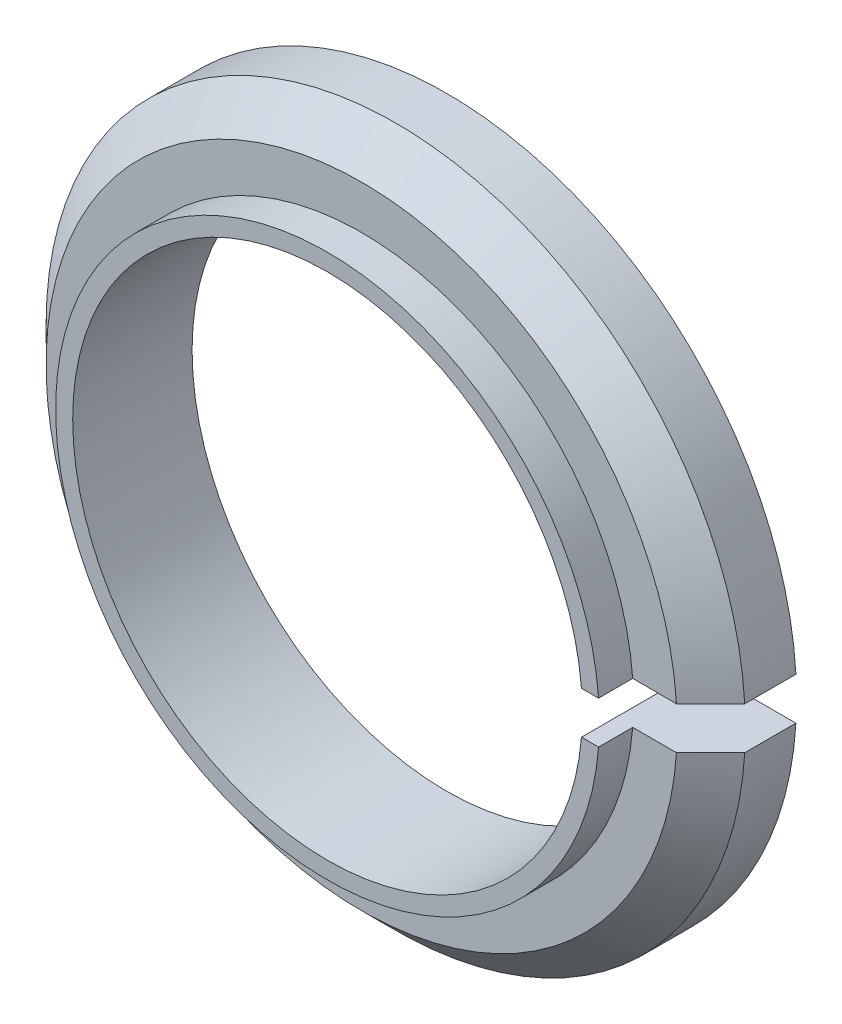
ISO-10303-21;
HEADER;
FILE_DESCRIPTION(('STEP AP214'),'2;1');
FILE_NAME('part.step','',(''),(''),'','','');
FILE_SCHEMA(('AUTOMOTIVE_DESIGN { 1 0 10303 214 1 1 1 1 }'));
ENDSEC;
DATA;
#1=APPLICATION_CONTEXT('core data for automotive mechanical design processes');
#2=APPLICATION_PROTOCOL_DEFINITION('international standard','automotive_design',2000,#1);
#3=PRODUCT_CONTEXT('',#1,'mechanical');
#4=PRODUCT('Part','Part','',(#3));
#5=PRODUCT_RELATED_PRODUCT_CATEGORY('part','',(#4));
#6=PRODUCT_DEFINITION_FORMATION('','',#4);
#7=PRODUCT_DEFINITION_CONTEXT('part definition',#1,'design');
#8=PRODUCT_DEFINITION('design','',#6,#7);
#9=PRODUCT_DEFINITION_SHAPE('','',#8);
#10=(LENGTH_UNIT() NAMED_UNIT(*) SI_UNIT(.MILLI.,.METRE.));
#11=(NAMED_UNIT(*) PLANE_ANGLE_UNIT() SI_UNIT($,.RADIAN.));
#12=(NAMED_UNIT(*) SI_UNIT($,.STERADIAN.) SOLID_ANGLE_UNIT());
#13=UNCERTAINTY_MEASURE_WITH_UNIT(LENGTH_MEASURE(1.E-05),#10,'distance_accuracy_value','');
#14=(GEOMETRIC_REPRESENTATION_CONTEXT(3) GLOBAL_UNCERTAINTY_ASSIGNED_CONTEXT((#13)) GLOBAL_UNIT_ASSIGNED_CONTEXT((#10,
#11,#12)) REPRESENTATION_CONTEXT('',''));
#15=CARTESIAN_POINT('',(0.,0.,0.));
#16=DIRECTION('',(0.,0.,1.));
#17=DIRECTION('',(1.,0.,0.));
#18=AXIS2_PLACEMENT_3D('',#15,#16,#17);
#19=CARTESIAN_POINT('',(0.,0.,7.));
#20=DIRECTION('',(0.,0.,-1.));
#21=DIRECTION('',(-1.,0.,0.));
#22=AXIS2_PLACEMENT_3D('',#19,#20,#21);
#23=CYLINDRICAL_SURFACE('',#22,14.94);
#24=DIRECTION('',(0.,0.,-1.));
#25=VECTOR('',#24,1.);
#26=CARTESIAN_POINT('',(14.8883478225926,-1.24124901349508,7.));
#27=LINE('',#26,#25);
#28=CARTESIAN_POINT('',(14.8883478225926,-1.24124901349508,0.));
#29=VERTEX_POINT('',#28);
#30=CARTESIAN_POINT('',(14.8883478225926,-1.24124901349508,7.));
#31=VERTEX_POINT('',#30);
#32=EDGE_CURVE('E261',#29,#31,#27,.F.);
#33=ORIENTED_EDGE('',*,*,#32,.F.);
#34=CARTESIAN_POINT('',(0.,0.,0.));
#35=DIRECTION('',(0.,0.,1.));
#36=DIRECTION('',(1.,0.,0.));
#37=AXIS2_PLACEMENT_3D('',#34,#35,#36);
#38=CIRCLE('',#37,14.94);
#39=CARTESIAN_POINT('',(14.8883478225926,1.24124901349508,0.));
#40=VERTEX_POINT('',#39);
#41=EDGE_CURVE('E130',#40,#29,#38,.T.);
#42=ORIENTED_EDGE('',*,*,#41,.F.);
#43=DIRECTION('',(0.,0.,-1.));
#44=VECTOR('',#43,1.);
#45=CARTESIAN_POINT('',(14.8883478225926,1.24124901349508,7.));
#46=LINE('',#45,#44);
#47=CARTESIAN_POINT('',(14.8883478225926,1.24124901349508,7.));
#48=VERTEX_POINT('',#47);
#49=EDGE_CURVE('E113',#48,#40,#46,.T.);
#50=ORIENTED_EDGE('',*,*,#49,.F.);
#51=CARTESIAN_POINT('',(0.,0.,7.));
#52=DIRECTION('',(0.,0.,1.));
#53=DIRECTION('',(1.,0.,0.));
#54=AXIS2_PLACEMENT_3D('',#51,#52,#53);
#55=CIRCLE('',#54,14.94);
#56=EDGE_CURVE('E128',#48,#31,#55,.T.);
#57=ORIENTED_EDGE('',*,*,#56,.T.);
#58=EDGE_LOOP('',(#33,#42,#50,#57));
#59=FACE_BOUND('',#58,.T.);
#60=ADVANCED_FACE('F46',(#59),#23,.F.);
#61=CARTESIAN_POINT('',(0.,0.,7.));
#62=DIRECTION('',(0.,0.,-1.));
#63=DIRECTION('',(-1.,0.,0.));
#64=AXIS2_PLACEMENT_3D('',#61,#62,#63);
#65=CYLINDRICAL_SURFACE('',#64,15.94);
#66=CARTESIAN_POINT('',(0.,0.,5.));
#67=DIRECTION('',(0.,0.,1.));
#68=DIRECTION('',(1.,0.,0.));
#69=AXIS2_PLACEMENT_3D('',#66,#67,#68);
#70=CIRCLE('',#69,15.94);
#71=CARTESIAN_POINT('',(15.8915984371144,1.24124901349508,5.));
#72=VERTEX_POINT('',#71);
#73=CARTESIAN_POINT('',(15.8915984371144,-1.24124901349508,5.));
#74=VERTEX_POINT('',#73);
#75=EDGE_CURVE('E142',#72,#74,#70,.T.);
#76=ORIENTED_EDGE('',*,*,#75,.T.);
#77=DIRECTION('',(0.,0.,-1.));
#78=VECTOR('',#77,1.);
#79=CARTESIAN_POINT('',(15.8915984371144,-1.24124901349508,7.));
#80=LINE('',#79,#78);
#81=CARTESIAN_POINT('',(15.8915984371144,-1.24124901349508,7.));
#82=VERTEX_POINT('',#81);
#83=EDGE_CURVE('E266',#74,#82,#80,.F.);
#84=ORIENTED_EDGE('',*,*,#83,.T.);
#85=CARTESIAN_POINT('',(0.,0.,7.));
#86=DIRECTION('',(0.,0.,1.));
#87=DIRECTION('',(1.,0.,0.));
#88=AXIS2_PLACEMENT_3D('',#85,#86,#87);
#89=CIRCLE('',#88,15.94);
#90=CARTESIAN_POINT('',(15.8915984371144,1.24124901349508,7.));
#91=VERTEX_POINT('',#90);
#92=EDGE_CURVE('E136',#91,#82,#89,.T.);
#93=ORIENTED_EDGE('',*,*,#92,.F.);
#94=DIRECTION('',(0.,0.,-1.));
#95=VECTOR('',#94,1.);
#96=CARTESIAN_POINT('',(15.8915984371144,1.24124901349508,7.));
#97=LINE('',#96,#95);
#98=EDGE_CURVE('E116',#91,#72,#97,.T.);
#99=ORIENTED_EDGE('',*,*,#98,.T.);
#100=EDGE_LOOP('',(#76,#84,#93,#99));
#101=FACE_BOUND('',#100,.T.);
#102=ADVANCED_FACE('F176',(#101),#65,.T.);
#103=CARTESIAN_POINT('',(0.,0.,7.));
#104=DIRECTION('',(0.,0.,1.));
#105=DIRECTION('',(1.,0.,0.));
#106=AXIS2_PLACEMENT_3D('',#103,#104,#105);
#107=PLANE('',#106);
#108=DIRECTION('',(1.,0.,0.));
#109=VECTOR('',#108,1.);
#110=CARTESIAN_POINT('',(7.5,-1.24124901349508,7.));
#111=LINE('',#110,#109);
#112=EDGE_CURVE('E122',#31,#82,#111,.T.);
#113=ORIENTED_EDGE('',*,*,#112,.F.);
#114=ORIENTED_EDGE('',*,*,#56,.F.);
#115=DIRECTION('',(1.,0.,0.));
#116=VECTOR('',#115,1.);
#117=CARTESIAN_POINT('',(7.5,1.24124901349508,7.));
#118=LINE('',#117,#116);
#119=EDGE_CURVE('E110',#48,#91,#118,.T.);
#120=ORIENTED_EDGE('',*,*,#119,.T.);
#121=ORIENTED_EDGE('',*,*,#92,.T.);
#122=EDGE_LOOP('',(#113,#114,#120,#121));
#123=FACE_BOUND('',#122,.T.);
#124=ADVANCED_FACE('F134',(#123),#107,.T.);
#125=CARTESIAN_POINT('',(0.,0.,0.));
#126=DIRECTION('',(0.,0.,1.));
#127=DIRECTION('',(1.,0.,0.));
#128=AXIS2_PLACEMENT_3D('',#125,#126,#127);
#129=PLANE('',#128);
#130=ORIENTED_EDGE('',*,*,#41,.T.);
#131=DIRECTION('',(1.,0.,0.));
#132=VECTOR('',#131,1.);
#133=CARTESIAN_POINT('',(0.,-1.24124901349508,0.));
#134=LINE('',#133,#132);
#135=CARTESIAN_POINT('',(20.4623874679006,-1.24124901349508,0.));
#136=VERTEX_POINT('',#135);
#137=EDGE_CURVE('E264',#29,#136,#134,.T.);
#138=ORIENTED_EDGE('',*,*,#137,.T.);
#139=CARTESIAN_POINT('',(0.,0.,0.));
#140=DIRECTION('',(0.,0.,1.));
#141=DIRECTION('',(1.,0.,0.));
#142=AXIS2_PLACEMENT_3D('',#139,#140,#141);
#143=CIRCLE('',#142,20.5);
#144=CARTESIAN_POINT('',(20.4623874679006,1.24124901349508,0.));
#145=VERTEX_POINT('',#144);
#146=EDGE_CURVE('E145',#145,#136,#143,.T.);
#147=ORIENTED_EDGE('',*,*,#146,.F.);
#148=DIRECTION('',(-1.,0.,0.));
#149=VECTOR('',#148,1.);
#150=CARTESIAN_POINT('',(0.,1.24124901349508,0.));
#151=LINE('',#150,#149);
#152=EDGE_CURVE('E290',#145,#40,#151,.T.);
#153=ORIENTED_EDGE('',*,*,#152,.T.);
#154=EDGE_LOOP('',(#130,#138,#147,#153));
#155=FACE_BOUND('',#154,.T.);
#156=ADVANCED_FACE('F172',(#155),#129,.F.);
#157=CARTESIAN_POINT('',(0.,0.,5.));
#158=DIRECTION('',(0.,0.,-1.));
#159=DIRECTION('',(-1.,0.,0.));
#160=AXIS2_PLACEMENT_3D('',#157,#158,#159);
#161=CYLINDRICAL_SURFACE('',#160,20.5);
#162=ORIENTED_EDGE('',*,*,#146,.T.);
#163=DIRECTION('',(0.,0.,-1.));
#164=VECTOR('',#163,1.);
#165=CARTESIAN_POINT('',(20.4623874679006,-1.24124901349508,5.));
#166=LINE('',#165,#164);
#167=CARTESIAN_POINT('',(20.4623874679007,-1.24124901349508,2.99999999999998));
#168=VERTEX_POINT('',#167);
#169=EDGE_CURVE('E280',#136,#168,#166,.F.);
#170=ORIENTED_EDGE('',*,*,#169,.T.);
#171=CARTESIAN_POINT('',(0.,0.,2.99999999999998));
#172=DIRECTION('',(0.,0.,1.));
#173=DIRECTION('',(1.,0.,0.));
#174=AXIS2_PLACEMENT_3D('',#171,#172,#173);
#175=CIRCLE('',#174,20.5);
#176=CARTESIAN_POINT('',(20.4623874679007,1.24124901349508,2.99999999999998));
#177=VERTEX_POINT('',#176);
#178=EDGE_CURVE('E151',#168,#177,#175,.F.);
#179=ORIENTED_EDGE('',*,*,#178,.T.);
#180=DIRECTION('',(0.,0.,-1.));
#181=VECTOR('',#180,1.);
#182=CARTESIAN_POINT('',(20.4623874679006,1.24124901349508,5.));
#183=LINE('',#182,#181);
#184=EDGE_CURVE('E76',#177,#145,#183,.T.);
#185=ORIENTED_EDGE('',*,*,#184,.T.);
#186=EDGE_LOOP('',(#162,#170,#179,#185));
#187=FACE_BOUND('',#186,.T.);
#188=ADVANCED_FACE('F168',(#187),#161,.T.);
#189=CARTESIAN_POINT('',(0.,0.,5.));
#190=DIRECTION('',(0.,0.,1.));
#191=DIRECTION('',(1.,0.,0.));
#192=AXIS2_PLACEMENT_3D('',#189,#190,#191);
#193=PLANE('',#192);
#194=DIRECTION('',(1.,0.,0.));
#195=VECTOR('',#194,1.);
#196=CARTESIAN_POINT('',(0.,-1.24124901349508,5.));
#197=LINE('',#196,#195);
#198=CARTESIAN_POINT('',(18.4583125145962,-1.24124901349508,5.));
#199=VERTEX_POINT('',#198);
#200=EDGE_CURVE('E68',#74,#199,#197,.T.);
#201=ORIENTED_EDGE('',*,*,#200,.F.);
#202=ORIENTED_EDGE('',*,*,#75,.F.);
#203=DIRECTION('',(-1.,0.,0.));
#204=VECTOR('',#203,1.);
#205=CARTESIAN_POINT('',(0.,1.24124901349508,5.));
#206=LINE('',#205,#204);
#207=CARTESIAN_POINT('',(18.4583125145962,1.24124901349508,5.));
#208=VERTEX_POINT('',#207);
#209=EDGE_CURVE('E277',#208,#72,#206,.T.);
#210=ORIENTED_EDGE('',*,*,#209,.F.);
#211=CARTESIAN_POINT('',(0.,0.,5.));
#212=DIRECTION('',(0.,0.,1.));
#213=DIRECTION('',(1.,0.,0.));
#214=AXIS2_PLACEMENT_3D('',#211,#212,#213);
#215=CIRCLE('',#214,18.5);
#216=EDGE_CURVE('E140',#208,#199,#215,.T.);
#217=ORIENTED_EDGE('',*,*,#216,.T.);
#218=EDGE_LOOP('',(#201,#202,#210,#217));
#219=FACE_BOUND('',#218,.T.);
#220=ADVANCED_FACE('F165',(#219),#193,.T.);
#221=CARTESIAN_POINT('',(0.,0.,5.));
#222=DIRECTION('',(0.,0.,-1.));
#223=DIRECTION('',(-1.,0.,0.));
#224=AXIS2_PLACEMENT_3D('',#221,#222,#223);
#225=CONICAL_SURFACE('',#224,18.5,0.785398163397444);
#226=CARTESIAN_POINT('',(5.20078300838781,-1.24124901349508,18.1531464379659));
#227=CARTESIAN_POINT('',(5.3878817092862,-1.24124901349508,17.9711451392538));
#228=CARTESIAN_POINT('',(5.57473038950169,-1.24124901349508,17.7888873803852));
#229=CARTESIAN_POINT('',(5.94803068854671,-1.24124901349508,17.4239662594592));
#230=CARTESIAN_POINT('',(6.1344823080695,-1.24124901349508,17.2413028981109));
#231=CARTESIAN_POINT('',(6.69339522977639,-1.24124901349508,16.6928661906019));
#232=CARTESIAN_POINT('',(7.06541639523634,-1.24124901349508,16.326644465886));
#233=CARTESIAN_POINT('',(7.80872983591119,-1.24124901349508,15.593467518645));
#234=CARTESIAN_POINT('',(8.18002211584558,-1.24124901349508,15.2265123009005));
#235=CARTESIAN_POINT('',(8.9221198230069,-1.24124901349508,14.492108837721));
#236=CARTESIAN_POINT('',(9.29292524945926,-1.24124901349508,14.1246605915035));
#237=CARTESIAN_POINT('',(10.4048277489189,-1.24124901349508,13.0218280476126));
#238=CARTESIAN_POINT('',(11.1454261101641,-1.24124901349508,12.2859410534457));
#239=CARTESIAN_POINT('',(12.6259087231005,-1.24124901349508,10.8134489918034));
#240=CARTESIAN_POINT('',(13.3657929745376,-1.24124901349508,10.0768439240728));
#241=CARTESIAN_POINT('',(15.5848104464516,-1.24124901349508,7.86639106068883));
#242=CARTESIAN_POINT('',(17.0633083913487,-1.24124901349508,6.39190559806807));
#243=CARTESIAN_POINT('',(20.0195891654873,-1.24124901349508,3.44219487461932));
#244=CARTESIAN_POINT('',(21.4973719889539,-1.24124901349508,1.96696960800674));
#245=CARTESIAN_POINT('',(24.4525328833229,-1.24124901349508,-0.983885565350286));
#246=CARTESIAN_POINT('',(25.9299109543257,-1.24124901349508,-2.45951547199424));
#247=CARTESIAN_POINT('',(28.4444503805018,-1.24124901349508,-4.97148237506527));
#248=CARTESIAN_POINT('',(29.4816717441238,-1.24124901349508,-6.00775931044401));
#249=CARTESIAN_POINT('',(31.5560212658822,-1.24124901349508,-8.08039636989427));
#250=CARTESIAN_POINT('',(32.5931494244476,-1.24124901349508,-9.11675649353642));
#251=CARTESIAN_POINT('',(33.63024778472,-1.24124901349508,-10.1531464379659));
#252=B_SPLINE_CURVE_WITH_KNOTS('',3,(#226,#227,#228,#229,#230,#231,#232,#233,#234,#235,#236,
#237,#238,#239,#240,#241,#242,#243,#244,#245,#246,#247,#248,#249,#250,#251),.UNSPECIFIED.,.F.,
.F.,(4,2,2,2,2,2,2,2,2,2,2,2,4),(0.,0.783053184186157,1.56610500005569,3.13220108945695,
4.69828700482056,6.26437540874654,9.39648866214647,12.5286030294895,18.7928317353407,
25.057110210292,31.3213871311367,35.7199417105184,40.1184748848384),.UNSPECIFIED.);
#253=EDGE_CURVE('E11',#199,#168,#252,.T.);
#254=ORIENTED_EDGE('',*,*,#253,.F.);
#255=ORIENTED_EDGE('',*,*,#216,.F.);
#256=CARTESIAN_POINT('',(33.63024778472,1.24124901349508,-10.1531464379659));
#257=CARTESIAN_POINT('',(32.4478429590741,1.24124901349508,-8.97155340297452));
#258=CARTESIAN_POINT('',(31.2654025091346,1.24124901349508,-7.78999600556296));
#259=CARTESIAN_POINT('',(28.9004023690464,1.24124901349508,-5.42700220169856));
#260=CARTESIAN_POINT('',(27.7178426789815,1.24124901349508,-4.245565795162));
#261=CARTESIAN_POINT('',(25.3525574304964,1.24124901349508,-1.88286504989117));
#262=CARTESIAN_POINT('',(24.1698318725062,1.24124901349508,-0.701600710726475));
#263=CARTESIAN_POINT('',(21.8041221377248,1.24124901349508,1.66067061816379));
#264=CARTESIAN_POINT('',(20.6211379607574,1.24124901349508,2.84167760771288));
#265=CARTESIAN_POINT('',(18.8463371271142,1.24124901349508,4.61286870776048));
#266=CARTESIAN_POINT('',(18.2546812946236,1.24124901349508,5.20321396628076));
#267=CARTESIAN_POINT('',(17.0712250715311,1.24124901349508,6.38375937622587));
#268=CARTESIAN_POINT('',(16.4794246809539,1.24124901349508,6.97395952767529));
#269=CARTESIAN_POINT('',(15.2956273888063,1.24124901349508,8.15416053909624));
#270=CARTESIAN_POINT('',(14.7036304876019,1.24124901349508,8.74416139943481));
#271=CARTESIAN_POINT('',(13.5193559557811,1.24124901349508,9.92388208081025));
#272=CARTESIAN_POINT('',(12.9270783249923,1.24124901349508,10.5136019016742));
#273=CARTESIAN_POINT('',(11.7421008480596,1.24124901349508,11.6926247363277));
#274=CARTESIAN_POINT('',(11.1494009992646,1.24124901349508,12.2819277474529));
#275=CARTESIAN_POINT('',(9.96334813595372,1.24124901349508,13.4598744809042));
#276=CARTESIAN_POINT('',(9.36999512256039,1.24124901349508,14.0485182043599));
#277=CARTESIAN_POINT('',(8.47910658913204,1.24124901349508,14.930621075542));
#278=CARTESIAN_POINT('',(8.18199940195256,1.24124901349508,15.224512738001));
#279=CARTESIAN_POINT('',(7.58738715505368,1.24124901349508,15.8118927783583));
#280=CARTESIAN_POINT('',(7.28988209573534,1.24124901349508,16.1053811566625));
#281=CARTESIAN_POINT('',(6.69430800533086,1.24124901349508,16.6917892249871));
#282=CARTESIAN_POINT('',(6.39623897075847,1.24124901349508,16.9847089114692));
#283=CARTESIAN_POINT('',(5.94850404012413,1.24124901349508,17.4234452613751));
#284=CARTESIAN_POINT('',(5.79915357956486,1.24124901349508,17.5695837620631));
#285=CARTESIAN_POINT('',(5.50018414674356,1.24124901349508,17.8615861541657));
#286=CARTESIAN_POINT('',(5.35056517417139,1.24124901349508,18.0074500452626));
#287=CARTESIAN_POINT('',(5.20078300838782,1.24124901349508,18.1531464379659));
#288=B_SPLINE_CURVE_WITH_KNOTS('',3,(#256,#257,#258,#259,#260,#261,#262,#263,#264,#265,#266,
#267,#268,#269,#270,#271,#272,#273,#274,#275,#276,#277,#278,#279,#280,#281,#282,#283,#284,#285,
#286,#287),.UNSPECIFIED.,.F.,.F.,(4,2,2,2,2,2,2,2,2,2,2,2,2,2,2,4),(0.,5.01479706137392,
10.029590628611,15.0443714279919,20.0591556555406,22.5665601399952,25.0739641989142,
27.5813636142678,30.088764570217,32.5961814113637,35.1035939500017,36.3573101114446,
37.6110250101314,38.8647476842282,39.4916111480317,40.1184753364016),.UNSPECIFIED.);
#289=EDGE_CURVE('E62',#177,#208,#288,.T.);
#290=ORIENTED_EDGE('',*,*,#289,.F.);
#291=ORIENTED_EDGE('',*,*,#178,.F.);
#292=EDGE_LOOP('',(#254,#255,#290,#291));
#293=FACE_BOUND('',#292,.T.);
#294=ADVANCED_FACE('F49',(#293),#225,.T.);
#295=CARTESIAN_POINT('',(7.5,1.24124901349508,7.));
#296=DIRECTION('',(0.,1.,0.));
#297=DIRECTION('',(0.,0.,1.));
#298=AXIS2_PLACEMENT_3D('',#295,#296,#297);
#299=PLANE('',#298);
#300=ORIENTED_EDGE('',*,*,#49,.T.);
#301=ORIENTED_EDGE('',*,*,#152,.F.);
#302=ORIENTED_EDGE('',*,*,#184,.F.);
#303=ORIENTED_EDGE('',*,*,#289,.T.);
#304=ORIENTED_EDGE('',*,*,#209,.T.);
#305=ORIENTED_EDGE('',*,*,#98,.F.);
#306=ORIENTED_EDGE('',*,*,#119,.F.);
#307=EDGE_LOOP('',(#300,#301,#302,#303,#304,#305,#306));
#308=FACE_BOUND('',#307,.T.);
#309=ADVANCED_FACE('F112',(#308),#299,.F.);
#310=CARTESIAN_POINT('',(7.5,-1.24124901349508,7.));
#311=DIRECTION('',(0.,-1.,0.));
#312=DIRECTION('',(0.,0.,-1.));
#313=AXIS2_PLACEMENT_3D('',#310,#311,#312);
#314=PLANE('',#313);
#315=ORIENTED_EDGE('',*,*,#32,.T.);
#316=ORIENTED_EDGE('',*,*,#112,.T.);
#317=ORIENTED_EDGE('',*,*,#83,.F.);
#318=ORIENTED_EDGE('',*,*,#200,.T.);
#319=ORIENTED_EDGE('',*,*,#253,.T.);
#320=ORIENTED_EDGE('',*,*,#169,.F.);
#321=ORIENTED_EDGE('',*,*,#137,.F.);
#322=EDGE_LOOP('',(#315,#316,#317,#318,#319,#320,#321));
#323=FACE_BOUND('',#322,.T.);
#324=ADVANCED_FACE('F163',(#323),#314,.F.);
#325=CLOSED_SHELL('',(#60,#102,#124,#156,#188,#220,#294,#309,#324));
#326=MANIFOLD_SOLID_BREP('B2',#325);
#327=ADVANCED_BREP_SHAPE_REPRESENTATION('',(#18,#326),#14);
#328=SHAPE_DEFINITION_REPRESENTATION(#9,#327);
ENDSEC;
END-ISO-10303-21;
